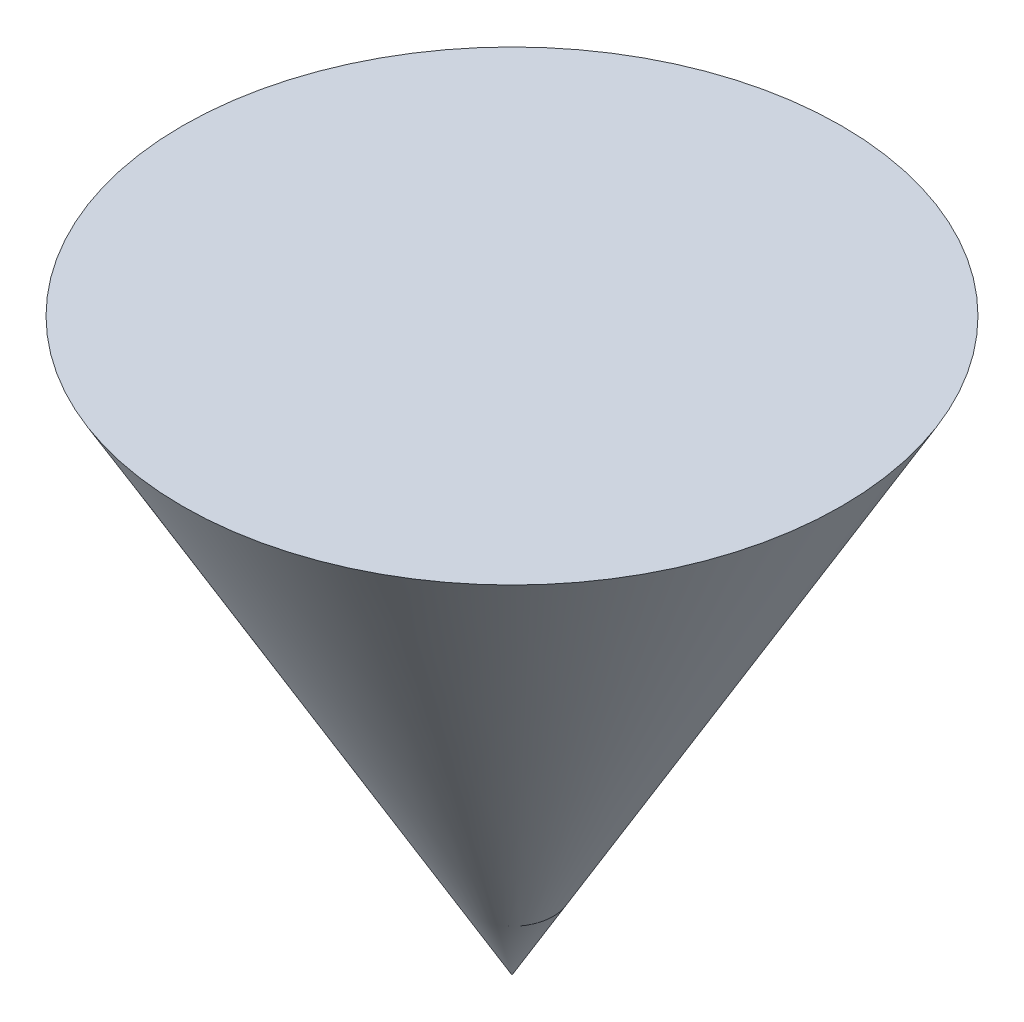
ISO-10303-21;
HEADER;
FILE_DESCRIPTION(('STEP AP214'),'2;1');
FILE_NAME('part.step','',(''),(''),'','','');
FILE_SCHEMA(('AUTOMOTIVE_DESIGN { 1 0 10303 214 1 1 1 1 }'));
ENDSEC;
DATA;
#1=APPLICATION_CONTEXT('core data for automotive mechanical design processes');
#2=APPLICATION_PROTOCOL_DEFINITION('international standard','automotive_design',2000,#1);
#3=PRODUCT_CONTEXT('',#1,'mechanical');
#4=PRODUCT('Part','Part','',(#3));
#5=PRODUCT_RELATED_PRODUCT_CATEGORY('part','',(#4));
#6=PRODUCT_DEFINITION_FORMATION('','',#4);
#7=PRODUCT_DEFINITION_CONTEXT('part definition',#1,'design');
#8=PRODUCT_DEFINITION('design','',#6,#7);
#9=PRODUCT_DEFINITION_SHAPE('','',#8);
#10=(LENGTH_UNIT() NAMED_UNIT(*) SI_UNIT(.MILLI.,.METRE.));
#11=(NAMED_UNIT(*) PLANE_ANGLE_UNIT() SI_UNIT($,.RADIAN.));
#12=(NAMED_UNIT(*) SI_UNIT($,.STERADIAN.) SOLID_ANGLE_UNIT());
#13=UNCERTAINTY_MEASURE_WITH_UNIT(LENGTH_MEASURE(1.E-05),#10,'distance_accuracy_value','');
#14=(GEOMETRIC_REPRESENTATION_CONTEXT(3) GLOBAL_UNCERTAINTY_ASSIGNED_CONTEXT((#13)) GLOBAL_UNIT_ASSIGNED_CONTEXT((#10,
#11,#12)) REPRESENTATION_CONTEXT('',''));
#15=CARTESIAN_POINT('',(0.,0.,0.));
#16=DIRECTION('',(0.,0.,1.));
#17=DIRECTION('',(1.,0.,0.));
#18=AXIS2_PLACEMENT_3D('',#15,#16,#17);
#19=CARTESIAN_POINT('',(0.,0.,0.));
#20=DIRECTION('',(0.,1.,0.));
#21=DIRECTION('',(0.,0.,1.));
#22=AXIS2_PLACEMENT_3D('',#19,#20,#21);
#23=CONICAL_SURFACE('',#22,0.,0.523598775598299);
#24=CARTESIAN_POINT('',(0.,61.4188741482167,0.));
#25=DIRECTION('',(0.,-1.,0.));
#26=DIRECTION('',(0.,0.,-1.));
#27=AXIS2_PLACEMENT_3D('',#24,#25,#26);
#28=CIRCLE('',#27,35.4602035227966);
#29=CARTESIAN_POINT('',(0.,61.4188741482167,-35.4602035227966));
#30=VERTEX_POINT('',#29);
#31=EDGE_CURVE('E11',#30,#30,#28,.T.);
#32=ORIENTED_EDGE('',*,*,#31,.T.);
#33=EDGE_LOOP('',(#32));
#34=FACE_BOUND('',#33,.T.);
#35=CARTESIAN_POINT('',(0.,0.,0.));
#36=VERTEX_POINT('',#35);
#37=VERTEX_LOOP('',#36);
#38=FACE_BOUND('',#37,.T.);
#39=ADVANCED_FACE('F33',(#34,#38),#23,.T.);
#40=CARTESIAN_POINT('',(35.4602035227966,61.4188741482167,0.));
#41=DIRECTION('',(0.,1.,0.));
#42=DIRECTION('',(0.,0.,1.));
#43=AXIS2_PLACEMENT_3D('',#40,#41,#42);
#44=PLANE('',#43);
#45=ORIENTED_EDGE('',*,*,#31,.F.);
#46=EDGE_LOOP('',(#45));
#47=FACE_BOUND('',#46,.T.);
#48=ADVANCED_FACE('F41',(#47),#44,.T.);
#49=CLOSED_SHELL('',(#39,#48));
#50=MANIFOLD_SOLID_BREP('B2',#49);
#51=ADVANCED_BREP_SHAPE_REPRESENTATION('',(#18,#50),#14);
#52=SHAPE_DEFINITION_REPRESENTATION(#9,#51);
ENDSEC;
END-ISO-10303-21;
